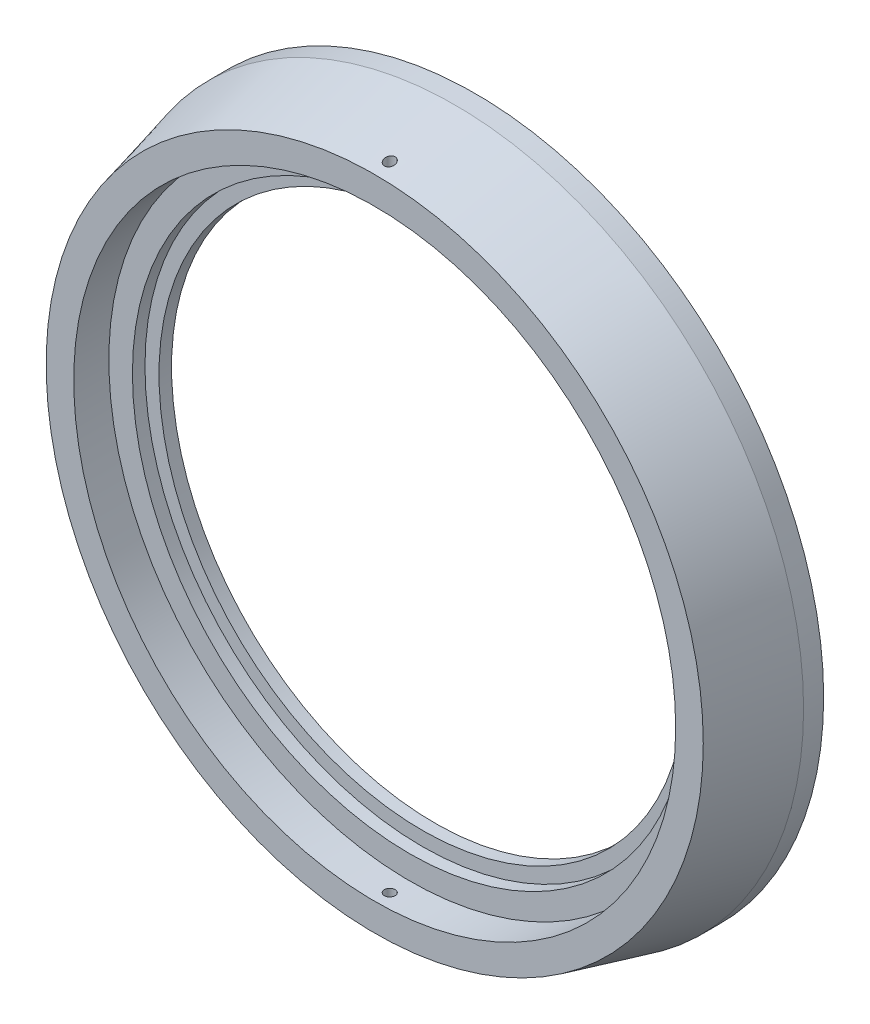
ISO-10303-21;
HEADER;
FILE_DESCRIPTION(('STEP AP214'),'2;1');
FILE_NAME('part.step','',(''),(''),'','','');
FILE_SCHEMA(('AUTOMOTIVE_DESIGN { 1 0 10303 214 1 1 1 1 }'));
ENDSEC;
DATA;
#1=APPLICATION_CONTEXT('core data for automotive mechanical design processes');
#2=APPLICATION_PROTOCOL_DEFINITION('international standard','automotive_design',2000,#1);
#3=PRODUCT_CONTEXT('',#1,'mechanical');
#4=PRODUCT('Part','Part','',(#3));
#5=PRODUCT_RELATED_PRODUCT_CATEGORY('part','',(#4));
#6=PRODUCT_DEFINITION_FORMATION('','',#4);
#7=PRODUCT_DEFINITION_CONTEXT('part definition',#1,'design');
#8=PRODUCT_DEFINITION('design','',#6,#7);
#9=PRODUCT_DEFINITION_SHAPE('','',#8);
#10=(LENGTH_UNIT() NAMED_UNIT(*) SI_UNIT(.MILLI.,.METRE.));
#11=(NAMED_UNIT(*) PLANE_ANGLE_UNIT() SI_UNIT($,.RADIAN.));
#12=(NAMED_UNIT(*) SI_UNIT($,.STERADIAN.) SOLID_ANGLE_UNIT());
#13=UNCERTAINTY_MEASURE_WITH_UNIT(LENGTH_MEASURE(1.E-05),#10,'distance_accuracy_value','');
#14=(GEOMETRIC_REPRESENTATION_CONTEXT(3) GLOBAL_UNCERTAINTY_ASSIGNED_CONTEXT((#13)) GLOBAL_UNIT_ASSIGNED_CONTEXT((#10,
#11,#12)) REPRESENTATION_CONTEXT('',''));
#15=CARTESIAN_POINT('',(0.,0.,0.));
#16=DIRECTION('',(0.,0.,1.));
#17=DIRECTION('',(1.,0.,0.));
#18=AXIS2_PLACEMENT_3D('',#15,#16,#17);
#19=CARTESIAN_POINT('',(0.,0.,25.4));
#20=DIRECTION('',(0.,0.,-1.));
#21=DIRECTION('',(-1.,0.,0.));
#22=AXIS2_PLACEMENT_3D('',#19,#20,#21);
#23=CYLINDRICAL_SURFACE('',#22,88.265);
#24=CARTESIAN_POINT('',(0.,0.,5.07999999999994));
#25=DIRECTION('',(0.,0.,1.));
#26=DIRECTION('',(1.,0.,0.));
#27=AXIS2_PLACEMENT_3D('',#24,#25,#26);
#28=CIRCLE('',#27,88.265);
#29=CARTESIAN_POINT('',(88.265,0.,5.07999999999994));
#30=VERTEX_POINT('',#29);
#31=EDGE_CURVE('E10',#30,#30,#28,.F.);
#32=ORIENTED_EDGE('',*,*,#31,.T.);
#33=EDGE_LOOP('',(#32));
#34=FACE_BOUND('',#33,.T.);
#35=CARTESIAN_POINT('',(0.,0.,0.));
#36=DIRECTION('',(0.,0.,1.));
#37=DIRECTION('',(1.,0.,0.));
#38=AXIS2_PLACEMENT_3D('',#35,#36,#37);
#39=CIRCLE('',#38,88.265);
#40=CARTESIAN_POINT('',(88.265,0.,0.));
#41=VERTEX_POINT('',#40);
#42=EDGE_CURVE('E121',#41,#41,#39,.T.);
#43=ORIENTED_EDGE('',*,*,#42,.T.);
#44=EDGE_LOOP('',(#43));
#45=FACE_BOUND('',#44,.T.);
#46=ADVANCED_FACE('F33',(#34,#45),#23,.T.);
#47=CARTESIAN_POINT('',(0.,0.,25.4));
#48=DIRECTION('',(0.,0.,1.));
#49=DIRECTION('',(1.,0.,0.));
#50=AXIS2_PLACEMENT_3D('',#47,#48,#49);
#51=PLANE('',#50);
#52=CARTESIAN_POINT('',(0.,0.,25.4));
#53=DIRECTION('',(0.,0.,1.));
#54=DIRECTION('',(1.,0.,0.));
#55=AXIS2_PLACEMENT_3D('',#52,#53,#54);
#56=CIRCLE('',#55,83.1850000000001);
#57=CARTESIAN_POINT('',(83.1850000000001,0.,25.4));
#58=VERTEX_POINT('',#57);
#59=EDGE_CURVE('E47',#58,#58,#56,.T.);
#60=ORIENTED_EDGE('',*,*,#59,.T.);
#61=EDGE_LOOP('',(#60));
#62=FACE_BOUND('',#61,.T.);
#63=CARTESIAN_POINT('',(0.,0.,25.4));
#64=DIRECTION('',(0.,0.,1.));
#65=DIRECTION('',(1.,0.,0.));
#66=AXIS2_PLACEMENT_3D('',#63,#64,#65);
#67=CIRCLE('',#66,76.2);
#68=CARTESIAN_POINT('',(76.2,0.,25.4));
#69=VERTEX_POINT('',#68);
#70=EDGE_CURVE('E127',#69,#69,#67,.T.);
#71=ORIENTED_EDGE('',*,*,#70,.F.);
#72=EDGE_LOOP('',(#71));
#73=FACE_BOUND('',#72,.T.);
#74=ADVANCED_FACE('F93',(#62,#73),#51,.T.);
#75=CARTESIAN_POINT('',(0.,0.,0.));
#76=DIRECTION('',(0.,0.,1.));
#77=DIRECTION('',(1.,0.,0.));
#78=AXIS2_PLACEMENT_3D('',#75,#76,#77);
#79=PLANE('',#78);
#80=CARTESIAN_POINT('',(0.,0.,0.));
#81=DIRECTION('',(0.,0.,1.));
#82=DIRECTION('',(1.,0.,0.));
#83=AXIS2_PLACEMENT_3D('',#80,#81,#82);
#84=CIRCLE('',#83,85.0900000000001);
#85=CARTESIAN_POINT('',(85.0900000000001,0.,0.));
#86=VERTEX_POINT('',#85);
#87=EDGE_CURVE('E120',#86,#86,#84,.T.);
#88=ORIENTED_EDGE('',*,*,#87,.T.);
#89=EDGE_LOOP('',(#88));
#90=FACE_BOUND('',#89,.T.);
#91=ORIENTED_EDGE('',*,*,#42,.F.);
#92=EDGE_LOOP('',(#91));
#93=FACE_BOUND('',#92,.T.);
#94=ADVANCED_FACE('F90',(#90,#93),#79,.F.);
#95=CARTESIAN_POINT('',(0.,0.,16.51));
#96=DIRECTION('',(0.,0.,1.));
#97=DIRECTION('',(1.,0.,0.));
#98=AXIS2_PLACEMENT_3D('',#95,#96,#97);
#99=CYLINDRICAL_SURFACE('',#98,76.2);
#100=CARTESIAN_POINT('',(0.,-76.2,22.94255));
#101=CARTESIAN_POINT('',(-0.0759669074774069,-76.1999998378742,22.9425466331847));
#102=CARTESIAN_POINT('',(-0.151988745815618,-76.1998851787984,22.936128421243));
#103=CARTESIAN_POINT('',(-0.301938301095269,-76.1994388035482,22.910614211512));
#104=CARTESIAN_POINT('',(-0.375863392927439,-76.1991068268139,22.8915029946487));
#105=CARTESIAN_POINT('',(-0.519425391470339,-76.1982634195032,22.8411473939451));
#106=CARTESIAN_POINT('',(-0.589064345061549,-76.1977520753791,22.8099088545182));
#107=CARTESIAN_POINT('',(-0.722089961107198,-76.1966076443374,22.7361935091371));
#108=CARTESIAN_POINT('',(-0.785478162989313,-76.195974587509,22.6937194797829));
#109=CARTESIAN_POINT('',(-0.904238684616683,-76.1946578574602,22.5987253088508));
#110=CARTESIAN_POINT('',(-0.95960937432539,-76.1939741739895,22.5462031294127));
#111=CARTESIAN_POINT('',(-1.06074967207332,-76.1926333390444,22.4326062917467));
#112=CARTESIAN_POINT('',(-1.10651890121301,-76.1919761886178,22.3715312961602));
#113=CARTESIAN_POINT('',(-1.1871565399293,-76.1907625089503,22.2425603957166));
#114=CARTESIAN_POINT('',(-1.22202443302614,-76.1902059844773,22.1746641678868));
#115=CARTESIAN_POINT('',(-1.27986607308,-76.1892563583924,22.0339805256085));
#116=CARTESIAN_POINT('',(-1.30283985227314,-76.1888632563375,21.9611931244169));
#117=CARTESIAN_POINT('',(-1.33623888601138,-76.1882848447229,21.8128013395294));
#118=CARTESIAN_POINT('',(-1.34666545686165,-76.1880995133665,21.7371972521851));
#119=CARTESIAN_POINT('',(-1.35467813973471,-76.1879574732292,21.5853116357057));
#120=CARTESIAN_POINT('',(-1.3522642847361,-76.1880007638611,21.509030108311));
#121=CARTESIAN_POINT('',(-1.33466579816262,-76.1883110655371,21.3579639178083));
#122=CARTESIAN_POINT('',(-1.3194826023224,-76.1885780514298,21.2831790873852));
#123=CARTESIAN_POINT('',(-1.27677864194829,-76.1893056048265,21.1372199900916));
#124=CARTESIAN_POINT('',(-1.24925785943487,-76.1897661726127,21.0660457284829));
#125=CARTESIAN_POINT('',(-1.18265830329285,-76.1908289954626,20.9293236170586));
#126=CARTESIAN_POINT('',(-1.14357887125426,-76.1914312585972,20.8637760880304));
#127=CARTESIAN_POINT('',(-1.05497185868232,-76.1927095654849,20.7401716609654));
#128=CARTESIAN_POINT('',(-1.00544427253683,-76.1933856092777,20.6821147669521));
#129=CARTESIAN_POINT('',(-0.897338724758428,-76.1947353741616,20.5751312510439));
#130=CARTESIAN_POINT('',(-0.838759514338877,-76.1954090949192,20.5262058910197));
#131=CARTESIAN_POINT('',(-0.714218000790629,-76.1966781696117,20.4388839872142));
#132=CARTESIAN_POINT('',(-0.648255696625329,-76.1972735235357,20.4004874449112));
#133=CARTESIAN_POINT('',(-0.510819774243615,-76.1983187488552,20.335313286856));
#134=CARTESIAN_POINT('',(-0.439346138116478,-76.1987686197779,20.3085357088649));
#135=CARTESIAN_POINT('',(-0.292916773538377,-76.1994721542837,20.2673604072213));
#136=CARTESIAN_POINT('',(-0.217961048506837,-76.1997258180595,20.2529626714121));
#137=CARTESIAN_POINT('',(-0.0667062213955087,-76.200008317358,20.2369573008651));
#138=CARTESIAN_POINT('',(0.00959269596030566,-76.200037183558,20.2353479209555));
#139=CARTESIAN_POINT('',(0.161377649239881,-76.1998669146438,20.2449604020077));
#140=CARTESIAN_POINT('',(0.236863685469302,-76.1996677796155,20.2561822581445));
#141=CARTESIAN_POINT('',(0.384875210611773,-76.199063976081,20.2911372152587));
#142=CARTESIAN_POINT('',(0.457400886251323,-76.1986593205598,20.3148695258137));
#143=CARTESIAN_POINT('',(0.597438637185702,-76.1976900897235,20.3741709020947));
#144=CARTESIAN_POINT('',(0.664950709369711,-76.1971255143091,20.409739975165));
#145=CARTESIAN_POINT('',(0.793052841652805,-76.1959000007932,20.4917096840977));
#146=CARTESIAN_POINT('',(0.853642149599283,-76.1952390522386,20.5381114952644));
#147=CARTESIAN_POINT('',(0.966171281089702,-76.1938953343097,20.6404277663038));
#148=CARTESIAN_POINT('',(1.01811109463508,-76.1932125649103,20.6963422371728));
#149=CARTESIAN_POINT('',(1.11187263263853,-76.1919020930612,20.8161040660548));
#150=CARTESIAN_POINT('',(1.15369323013789,-76.1912743967499,20.8799523064401));
#151=CARTESIAN_POINT('',(1.22602145423821,-76.1901449365393,21.0137646644544));
#152=CARTESIAN_POINT('',(1.25652909753619,-76.189643172454,21.0837287730567));
#153=CARTESIAN_POINT('',(1.30536345792658,-76.1888221910407,21.2277825717002));
#154=CARTESIAN_POINT('',(1.32369090964356,-76.1885029627034,21.301872012638));
#155=CARTESIAN_POINT('',(1.34764705469373,-76.1880830126007,21.4520769454782));
#156=CARTESIAN_POINT('',(1.35327573705041,-76.1879822910241,21.5281924391318));
#157=CARTESIAN_POINT('',(1.35167444377856,-76.1880107148274,21.680277357896));
#158=CARTESIAN_POINT('',(1.34444625847786,-76.1881398282026,21.7562468018694));
#159=CARTESIAN_POINT('',(1.31734006453382,-76.1886132989662,21.9058938214221));
#160=CARTESIAN_POINT('',(1.29746203056458,-76.1889576567854,21.9795713924125));
#161=CARTESIAN_POINT('',(1.24562035132228,-76.1898227950832,22.1225446571929));
#162=CARTESIAN_POINT('',(1.21365648578813,-76.1903435787769,22.1918402710959));
#163=CARTESIAN_POINT('',(1.13855198849061,-76.1915028311673,22.3240793760186));
#164=CARTESIAN_POINT('',(1.09541178343179,-76.1921412953707,22.387023109421));
#165=CARTESIAN_POINT('',(0.999177330169194,-76.1934639842775,22.5047778297104));
#166=CARTESIAN_POINT('',(0.946082755101834,-76.194148210483,22.5595885494342));
#167=CARTESIAN_POINT('',(0.83142986774511,-76.1954854555648,22.6595325567061));
#168=CARTESIAN_POINT('',(0.769869457865953,-76.1961384666527,22.7046634387537));
#169=CARTESIAN_POINT('',(0.64001700804528,-76.1973398063743,22.7839695263822));
#170=CARTESIAN_POINT('',(0.571721371015463,-76.197888078606,22.8181388358245));
#171=CARTESIAN_POINT('',(0.430415153129954,-76.1988170118837,22.8744869660583));
#172=CARTESIAN_POINT('',(0.357410332000133,-76.1991978733911,22.8966801346471));
#173=CARTESIAN_POINT('',(0.236618061433265,-76.1996468964467,22.9225427725886));
#174=CARTESIAN_POINT('',(0.189615204522879,-76.1997787384244,22.9300360924694));
#175=CARTESIAN_POINT('',(0.0950820726826146,-76.1999553409383,22.9400407596581));
#176=CARTESIAN_POINT('',(0.0475517978062935,-76.2000001014833,22.9425521074719));
#177=CARTESIAN_POINT('',(0.,-76.2,22.94255));
#178=B_SPLINE_CURVE_WITH_KNOTS('',3,(#100,#101,#102,#103,#104,#105,#106,#107,#108,#109,#110,
#111,#112,#113,#114,#115,#116,#117,#118,#119,#120,#121,#122,#123,#124,#125,#126,#127,#128,#129,
#130,#131,#132,#133,#134,#135,#136,#137,#138,#139,#140,#141,#142,#143,#144,#145,#146,#147,#148,
#149,#150,#151,#152,#153,#154,#155,#156,#157,#158,#159,#160,#161,#162,#163,#164,#165,#166,#167,
#168,#169,#170,#171,#172,#173,#174,#175,#176,#177),.UNSPECIFIED.,.T.,.F.,(4,2,2,2,2,2,2,2,2,2,2,
2,2,2,2,2,2,2,2,2,2,2,2,2,2,2,2,2,2,2,2,2,2,2,2,2,2,2,4),(0.,0.227727156300745,
0.455727854475548,0.683618810415413,0.911453500732213,1.13933444716636,1.36722438470652,
1.5951251175023,1.82302523262501,2.05090143706986,2.27877705625118,2.5066270574158,
2.73447739062671,2.96234070527086,3.19020414231008,3.41809904412168,3.64599397793029,
3.87388965238295,4.10178510304599,4.32964945326332,4.55751371779616,4.78536358737521,
5.01321359832837,5.24108834150329,5.46896334809294,5.69686372103955,5.92476375762211,
6.1526500476094,6.38053653457581,6.60839129067333,6.83624650295367,7.06410586803551,
7.29195653489346,7.51981468481001,7.74772939346766,7.97576649078758,8.20352978245351,
8.3460765459146,8.48862329490048),.UNSPECIFIED.);
#179=CARTESIAN_POINT('',(0.,-76.2,22.94255));
#180=VERTEX_POINT('',#179);
#181=EDGE_CURVE('E79',#180,#180,#178,.T.);
#182=ORIENTED_EDGE('',*,*,#181,.T.);
#183=EDGE_LOOP('',(#182));
#184=FACE_BOUND('',#183,.T.);
#185=CARTESIAN_POINT('',(0.,76.2,22.94255));
#186=CARTESIAN_POINT('',(0.0759669074774069,76.1999998378742,22.9425466331847));
#187=CARTESIAN_POINT('',(0.151988745815618,76.1998851787984,22.936128421243));
#188=CARTESIAN_POINT('',(0.301938301095269,76.1994388035482,22.910614211512));
#189=CARTESIAN_POINT('',(0.375863392927439,76.1991068268139,22.8915029946487));
#190=CARTESIAN_POINT('',(0.519425391470339,76.1982634195032,22.8411473939451));
#191=CARTESIAN_POINT('',(0.589064345061549,76.1977520753791,22.8099088545182));
#192=CARTESIAN_POINT('',(0.722089961107198,76.1966076443374,22.7361935091371));
#193=CARTESIAN_POINT('',(0.785478162989313,76.195974587509,22.6937194797829));
#194=CARTESIAN_POINT('',(0.904238684616683,76.1946578574602,22.5987253088508));
#195=CARTESIAN_POINT('',(0.95960937432539,76.1939741739895,22.5462031294127));
#196=CARTESIAN_POINT('',(1.06074967207332,76.1926333390444,22.4326062917467));
#197=CARTESIAN_POINT('',(1.10651890121301,76.1919761886178,22.3715312961602));
#198=CARTESIAN_POINT('',(1.1871565399293,76.1907625089503,22.2425603957166));
#199=CARTESIAN_POINT('',(1.22202443302614,76.1902059844773,22.1746641678868));
#200=CARTESIAN_POINT('',(1.27986607308,76.1892563583924,22.0339805256085));
#201=CARTESIAN_POINT('',(1.30283985227314,76.1888632563375,21.9611931244169));
#202=CARTESIAN_POINT('',(1.33623888601138,76.1882848447229,21.8128013395294));
#203=CARTESIAN_POINT('',(1.34666545686165,76.1880995133665,21.7371972521851));
#204=CARTESIAN_POINT('',(1.35467813973471,76.1879574732292,21.5853116357057));
#205=CARTESIAN_POINT('',(1.3522642847361,76.1880007638611,21.509030108311));
#206=CARTESIAN_POINT('',(1.33466579816262,76.1883110655371,21.3579639178083));
#207=CARTESIAN_POINT('',(1.3194826023224,76.1885780514298,21.2831790873852));
#208=CARTESIAN_POINT('',(1.27677864194829,76.1893056048265,21.1372199900916));
#209=CARTESIAN_POINT('',(1.24925785943487,76.1897661726127,21.0660457284829));
#210=CARTESIAN_POINT('',(1.18265830329285,76.1908289954626,20.9293236170586));
#211=CARTESIAN_POINT('',(1.14357887125426,76.1914312585972,20.8637760880304));
#212=CARTESIAN_POINT('',(1.05497185868232,76.1927095654849,20.7401716609654));
#213=CARTESIAN_POINT('',(1.00544427253683,76.1933856092777,20.6821147669521));
#214=CARTESIAN_POINT('',(0.897338724758428,76.1947353741616,20.5751312510439));
#215=CARTESIAN_POINT('',(0.838759514338877,76.1954090949192,20.5262058910197));
#216=CARTESIAN_POINT('',(0.714218000790629,76.1966781696117,20.4388839872142));
#217=CARTESIAN_POINT('',(0.648255696625329,76.1972735235357,20.4004874449112));
#218=CARTESIAN_POINT('',(0.510819774243615,76.1983187488552,20.335313286856));
#219=CARTESIAN_POINT('',(0.439346138116478,76.1987686197779,20.3085357088649));
#220=CARTESIAN_POINT('',(0.292916773538377,76.1994721542837,20.2673604072213));
#221=CARTESIAN_POINT('',(0.217961048506837,76.1997258180595,20.2529626714121));
#222=CARTESIAN_POINT('',(0.0667062213955087,76.200008317358,20.2369573008651));
#223=CARTESIAN_POINT('',(-0.00959269596030566,76.200037183558,20.2353479209555));
#224=CARTESIAN_POINT('',(-0.161377649239881,76.1998669146438,20.2449604020077));
#225=CARTESIAN_POINT('',(-0.236863685469302,76.1996677796155,20.2561822581445));
#226=CARTESIAN_POINT('',(-0.384875210611773,76.199063976081,20.2911372152587));
#227=CARTESIAN_POINT('',(-0.457400886251323,76.1986593205598,20.3148695258137));
#228=CARTESIAN_POINT('',(-0.597438637185702,76.1976900897235,20.3741709020947));
#229=CARTESIAN_POINT('',(-0.664950709369711,76.1971255143091,20.409739975165));
#230=CARTESIAN_POINT('',(-0.793052841652805,76.1959000007932,20.4917096840977));
#231=CARTESIAN_POINT('',(-0.853642149599283,76.1952390522386,20.5381114952644));
#232=CARTESIAN_POINT('',(-0.966171281089702,76.1938953343097,20.6404277663038));
#233=CARTESIAN_POINT('',(-1.01811109463508,76.1932125649103,20.6963422371728));
#234=CARTESIAN_POINT('',(-1.11187263263853,76.1919020930612,20.8161040660548));
#235=CARTESIAN_POINT('',(-1.15369323013789,76.1912743967499,20.8799523064401));
#236=CARTESIAN_POINT('',(-1.22602145423821,76.1901449365393,21.0137646644544));
#237=CARTESIAN_POINT('',(-1.25652909753619,76.189643172454,21.0837287730567));
#238=CARTESIAN_POINT('',(-1.30536345792658,76.1888221910407,21.2277825717002));
#239=CARTESIAN_POINT('',(-1.32369090964356,76.1885029627034,21.301872012638));
#240=CARTESIAN_POINT('',(-1.34764705469373,76.1880830126007,21.4520769454782));
#241=CARTESIAN_POINT('',(-1.35327573705041,76.1879822910241,21.5281924391318));
#242=CARTESIAN_POINT('',(-1.35167444377856,76.1880107148274,21.680277357896));
#243=CARTESIAN_POINT('',(-1.34444625847786,76.1881398282026,21.7562468018694));
#244=CARTESIAN_POINT('',(-1.31734006453382,76.1886132989662,21.9058938214221));
#245=CARTESIAN_POINT('',(-1.29746203056458,76.1889576567854,21.9795713924125));
#246=CARTESIAN_POINT('',(-1.24562035132228,76.1898227950832,22.1225446571929));
#247=CARTESIAN_POINT('',(-1.21365648578813,76.1903435787769,22.1918402710959));
#248=CARTESIAN_POINT('',(-1.13855198849061,76.1915028311673,22.3240793760186));
#249=CARTESIAN_POINT('',(-1.09541178343179,76.1921412953707,22.387023109421));
#250=CARTESIAN_POINT('',(-0.999177330169194,76.1934639842775,22.5047778297104));
#251=CARTESIAN_POINT('',(-0.946082755101834,76.194148210483,22.5595885494342));
#252=CARTESIAN_POINT('',(-0.83142986774511,76.1954854555648,22.6595325567061));
#253=CARTESIAN_POINT('',(-0.769869457865953,76.1961384666527,22.7046634387537));
#254=CARTESIAN_POINT('',(-0.64001700804528,76.1973398063743,22.7839695263822));
#255=CARTESIAN_POINT('',(-0.571721371015463,76.197888078606,22.8181388358245));
#256=CARTESIAN_POINT('',(-0.430415153129954,76.1988170118837,22.8744869660583));
#257=CARTESIAN_POINT('',(-0.357410332000133,76.1991978733911,22.8966801346471));
#258=CARTESIAN_POINT('',(-0.236618061433265,76.1996468964467,22.9225427725886));
#259=CARTESIAN_POINT('',(-0.189615204522879,76.1997787384244,22.9300360924694));
#260=CARTESIAN_POINT('',(-0.0950820726826146,76.1999553409383,22.9400407596581));
#261=CARTESIAN_POINT('',(-0.0475517978062935,76.2000001014833,22.9425521074719));
#262=CARTESIAN_POINT('',(0.,76.2,22.94255));
#263=B_SPLINE_CURVE_WITH_KNOTS('',3,(#185,#186,#187,#188,#189,#190,#191,#192,#193,#194,#195,
#196,#197,#198,#199,#200,#201,#202,#203,#204,#205,#206,#207,#208,#209,#210,#211,#212,#213,#214,
#215,#216,#217,#218,#219,#220,#221,#222,#223,#224,#225,#226,#227,#228,#229,#230,#231,#232,#233,
#234,#235,#236,#237,#238,#239,#240,#241,#242,#243,#244,#245,#246,#247,#248,#249,#250,#251,#252,
#253,#254,#255,#256,#257,#258,#259,#260,#261,#262),.UNSPECIFIED.,.T.,.F.,(4,2,2,2,2,2,2,2,2,2,2,
2,2,2,2,2,2,2,2,2,2,2,2,2,2,2,2,2,2,2,2,2,2,2,2,2,2,2,4),(0.,0.227727156300745,
0.455727854475548,0.683618810415413,0.911453500732213,1.13933444716636,1.36722438470652,
1.5951251175023,1.82302523262501,2.05090143706986,2.27877705625118,2.5066270574158,
2.73447739062671,2.96234070527086,3.19020414231008,3.41809904412168,3.64599397793029,
3.87388965238295,4.10178510304599,4.32964945326332,4.55751371779616,4.78536358737521,
5.01321359832837,5.24108834150329,5.46896334809294,5.69686372103955,5.92476375762211,
6.1526500476094,6.38053653457581,6.60839129067333,6.83624650295367,7.06410586803551,
7.29195653489346,7.51981468481001,7.74772939346766,7.97576649078758,8.20352978245351,
8.3460765459146,8.48862329490048),.UNSPECIFIED.);
#264=CARTESIAN_POINT('',(0.,76.2,22.94255));
#265=VERTEX_POINT('',#264);
#266=EDGE_CURVE('E73',#265,#265,#263,.T.);
#267=ORIENTED_EDGE('',*,*,#266,.T.);
#268=EDGE_LOOP('',(#267));
#269=FACE_BOUND('',#268,.T.);
#270=CARTESIAN_POINT('',(0.,0.,16.51));
#271=DIRECTION('',(0.,0.,1.));
#272=DIRECTION('',(1.,0.,0.));
#273=AXIS2_PLACEMENT_3D('',#270,#271,#272);
#274=CIRCLE('',#273,76.2);
#275=CARTESIAN_POINT('',(76.2,0.,16.51));
#276=VERTEX_POINT('',#275);
#277=EDGE_CURVE('E124',#276,#276,#274,.T.);
#278=ORIENTED_EDGE('',*,*,#277,.F.);
#279=EDGE_LOOP('',(#278));
#280=FACE_BOUND('',#279,.T.);
#281=ORIENTED_EDGE('',*,*,#70,.T.);
#282=EDGE_LOOP('',(#281));
#283=FACE_BOUND('',#282,.T.);
#284=ADVANCED_FACE('F84',(#184,#269,#280,#283),#99,.F.);
#285=CARTESIAN_POINT('',(0.,0.,16.51));
#286=DIRECTION('',(0.,0.,1.));
#287=DIRECTION('',(1.,0.,0.));
#288=AXIS2_PLACEMENT_3D('',#285,#286,#287);
#289=PLANE('',#288);
#290=CARTESIAN_POINT('',(0.,0.,16.51));
#291=DIRECTION('',(0.,0.,1.));
#292=DIRECTION('',(1.,0.,0.));
#293=AXIS2_PLACEMENT_3D('',#290,#291,#292);
#294=CIRCLE('',#293,70.231);
#295=CARTESIAN_POINT('',(70.231,0.,16.51));
#296=VERTEX_POINT('',#295);
#297=EDGE_CURVE('E133',#296,#296,#294,.T.);
#298=ORIENTED_EDGE('',*,*,#297,.F.);
#299=EDGE_LOOP('',(#298));
#300=FACE_BOUND('',#299,.T.);
#301=ORIENTED_EDGE('',*,*,#277,.T.);
#302=EDGE_LOOP('',(#301));
#303=FACE_BOUND('',#302,.T.);
#304=ADVANCED_FACE('F89',(#300,#303),#289,.T.);
#305=CARTESIAN_POINT('',(0.,0.,13.335));
#306=DIRECTION('',(0.,0.,1.));
#307=DIRECTION('',(1.,0.,0.));
#308=AXIS2_PLACEMENT_3D('',#305,#306,#307);
#309=CYLINDRICAL_SURFACE('',#308,70.231);
#310=CARTESIAN_POINT('',(0.,0.,13.335));
#311=DIRECTION('',(0.,0.,1.));
#312=DIRECTION('',(1.,0.,0.));
#313=AXIS2_PLACEMENT_3D('',#310,#311,#312);
#314=CIRCLE('',#313,70.231);
#315=CARTESIAN_POINT('',(70.231,0.,13.335));
#316=VERTEX_POINT('',#315);
#317=EDGE_CURVE('E130',#316,#316,#314,.T.);
#318=ORIENTED_EDGE('',*,*,#317,.F.);
#319=EDGE_LOOP('',(#318));
#320=FACE_BOUND('',#319,.T.);
#321=ORIENTED_EDGE('',*,*,#297,.T.);
#322=EDGE_LOOP('',(#321));
#323=FACE_BOUND('',#322,.T.);
#324=ADVANCED_FACE('F153',(#320,#323),#309,.F.);
#325=CARTESIAN_POINT('',(0.,0.,13.335));
#326=DIRECTION('',(0.,0.,1.));
#327=DIRECTION('',(1.,0.,0.));
#328=AXIS2_PLACEMENT_3D('',#325,#326,#327);
#329=PLANE('',#328);
#330=CARTESIAN_POINT('',(0.,0.,13.335));
#331=DIRECTION('',(0.,0.,1.));
#332=DIRECTION('',(1.,0.,0.));
#333=AXIS2_PLACEMENT_3D('',#330,#331,#332);
#334=CIRCLE('',#333,66.675);
#335=CARTESIAN_POINT('',(66.675,0.,13.335));
#336=VERTEX_POINT('',#335);
#337=EDGE_CURVE('E136',#336,#336,#334,.T.);
#338=ORIENTED_EDGE('',*,*,#337,.F.);
#339=EDGE_LOOP('',(#338));
#340=FACE_BOUND('',#339,.T.);
#341=ORIENTED_EDGE('',*,*,#317,.T.);
#342=EDGE_LOOP('',(#341));
#343=FACE_BOUND('',#342,.T.);
#344=ADVANCED_FACE('F113',(#340,#343),#329,.T.);
#345=CARTESIAN_POINT('',(0.,0.,0.));
#346=DIRECTION('',(0.,0.,1.));
#347=DIRECTION('',(1.,0.,0.));
#348=AXIS2_PLACEMENT_3D('',#345,#346,#347);
#349=CYLINDRICAL_SURFACE('',#348,66.675);
#350=CARTESIAN_POINT('',(0.,0.,10.16));
#351=DIRECTION('',(0.,0.,1.));
#352=DIRECTION('',(1.,0.,0.));
#353=AXIS2_PLACEMENT_3D('',#350,#351,#352);
#354=CIRCLE('',#353,66.675);
#355=CARTESIAN_POINT('',(66.675,0.,10.16));
#356=VERTEX_POINT('',#355);
#357=EDGE_CURVE('E52',#356,#356,#354,.F.);
#358=ORIENTED_EDGE('',*,*,#357,.T.);
#359=EDGE_LOOP('',(#358));
#360=FACE_BOUND('',#359,.T.);
#361=ORIENTED_EDGE('',*,*,#337,.T.);
#362=EDGE_LOOP('',(#361));
#363=FACE_BOUND('',#362,.T.);
#364=ADVANCED_FACE('F66',(#360,#363),#349,.F.);
#365=CARTESIAN_POINT('',(0.,0.,0.));
#366=DIRECTION('',(0.,0.,-1.));
#367=DIRECTION('',(-1.,0.,0.));
#368=AXIS2_PLACEMENT_3D('',#365,#366,#367);
#369=CONICAL_SURFACE('',#368,85.0900000000001,1.06663036531574);
#370=ORIENTED_EDGE('',*,*,#357,.F.);
#371=EDGE_LOOP('',(#370));
#372=FACE_BOUND('',#371,.T.);
#373=ORIENTED_EDGE('',*,*,#87,.F.);
#374=EDGE_LOOP('',(#373));
#375=FACE_BOUND('',#374,.T.);
#376=ADVANCED_FACE('F103',(#372,#375),#369,.F.);
#377=CARTESIAN_POINT('',(0.,0.,25.4));
#378=DIRECTION('',(0.,0.,-1.));
#379=DIRECTION('',(-1.,0.,0.));
#380=AXIS2_PLACEMENT_3D('',#377,#378,#379);
#381=CONICAL_SURFACE('',#380,83.1850000000001,0.24497866312686);
#382=CARTESIAN_POINT('',(-0.743547285817706,-84.4166844087982,20.4601641994001));
#383=CARTESIAN_POINT('',(-0.682041553541964,-84.4273448907409,20.4196905044803));
#384=CARTESIAN_POINT('',(-0.617033394790605,-84.4367412992307,20.384125323894));
#385=CARTESIAN_POINT('',(-0.48173859631147,-84.4526583190494,20.323979425223));
#386=CARTESIAN_POINT('',(-0.41144758478038,-84.4591765171684,20.2994079244628));
#387=CARTESIAN_POINT('',(-0.267539166721088,-84.4690839715068,20.2620919322633));
#388=CARTESIAN_POINT('',(-0.193920378946913,-84.4724719157212,20.2493524000268));
#389=CARTESIAN_POINT('',(-0.0455274544807273,-84.4759787855276,20.2361660644556));
#390=CARTESIAN_POINT('',(0.0292464278698867,-84.4760984207887,20.2357165925009));
#391=CARTESIAN_POINT('',(0.17690753627746,-84.4730841225392,20.2470501392199));
#392=CARTESIAN_POINT('',(0.249806603341921,-84.4699883096824,20.2586898350636));
#393=CARTESIAN_POINT('',(0.392561357537923,-84.46072118503,20.2935869274424));
#394=CARTESIAN_POINT('',(0.462416968108329,-84.4545497959139,20.3168446160561));
#395=CARTESIAN_POINT('',(0.597478124389547,-84.4393277143234,20.3743427126531));
#396=CARTESIAN_POINT('',(0.66266159592761,-84.4302643321929,20.4086315292288));
#397=CARTESIAN_POINT('',(0.786335323766511,-84.409590203723,20.4870799738712));
#398=CARTESIAN_POINT('',(0.844824905581787,-84.3979792010251,20.5312405953129));
#399=CARTESIAN_POINT('',(0.954987834302524,-84.372290743793,20.6292933409985));
#400=CARTESIAN_POINT('',(1.00646262459369,-84.358160529438,20.6833945932143));
#401=CARTESIAN_POINT('',(1.09964515871737,-84.3280944590419,20.7989964954559));
#402=CARTESIAN_POINT('',(1.14135137740102,-84.312158321621,20.8604982986501));
#403=CARTESIAN_POINT('',(1.21520747297268,-84.2784306560932,20.9912690807092));
#404=CARTESIAN_POINT('',(1.24700974753727,-84.2605961362294,21.0607233464705));
#405=CARTESIAN_POINT('',(1.29846285563551,-84.2240507268694,21.2037793913183));
#406=CARTESIAN_POINT('',(1.31811190024361,-84.2053397087905,21.2773817792592));
#407=CARTESIAN_POINT('',(1.34513933783405,-84.1670948794911,21.4286325469216));
#408=CARTESIAN_POINT('',(1.35219723366085,-84.1475522053887,21.506336114093));
#409=CARTESIAN_POINT('',(1.35287698626857,-84.1086567927326,21.6618539410862));
#410=CARTESIAN_POINT('',(1.34649788102117,-84.0893040678781,21.7396682084349));
#411=CARTESIAN_POINT('',(1.32032250753066,-84.0511808984592,21.8938021407227));
#412=CARTESIAN_POINT('',(1.3004253418633,-84.0324159507354,21.9701060935272));
#413=CARTESIAN_POINT('',(1.24756185356459,-83.9961474951633,22.118369146654));
#414=CARTESIAN_POINT('',(1.21459606139512,-83.9786439361486,22.1903284231922));
#415=CARTESIAN_POINT('',(1.1368891119592,-83.9455944690152,22.326864317141));
#416=CARTESIAN_POINT('',(1.09229699528194,-83.9300272250831,22.3915205046954));
#417=CARTESIAN_POINT('',(0.992311230009246,-83.9010415542389,22.5124210713763));
#418=CARTESIAN_POINT('',(0.936919041540139,-83.8876228373008,22.5686665857778));
#419=CARTESIAN_POINT('',(0.818393022827501,-83.863627895914,22.6695971226128));
#420=CARTESIAN_POINT('',(0.755490343643131,-83.8529883801635,22.7145384840494));
#421=CARTESIAN_POINT('',(0.622651526979279,-83.8344180049359,22.7931837921908));
#422=CARTESIAN_POINT('',(0.552716525611476,-83.8264867088378,22.8268895502867));
#423=CARTESIAN_POINT('',(0.409815349068226,-83.8137343098608,22.8811734658045));
#424=CARTESIAN_POINT('',(0.336980111975049,-83.8088357595051,22.9020783523646));
#425=CARTESIAN_POINT('',(0.188711720841459,-83.8019577031717,22.9314502620156));
#426=CARTESIAN_POINT('',(0.113278872540181,-83.799977854856,22.9399187437867));
#427=CARTESIAN_POINT('',(-0.0366389312943425,-83.7990010202694,22.944095683496));
#428=CARTESIAN_POINT('',(-0.111117534841726,-83.7999527189878,22.9400236559605));
#429=CARTESIAN_POINT('',(-0.258304842012806,-83.8047011122244,22.9197325115871));
#430=CARTESIAN_POINT('',(-0.33101360821341,-83.8084977060031,22.90351382487));
#431=CARTESIAN_POINT('',(-0.472464957484916,-83.8188218690026,22.8595053824765));
#432=CARTESIAN_POINT('',(-0.541215399769004,-83.8253437982332,22.8317395238481));
#433=CARTESIAN_POINT('',(-0.673040452439156,-83.8409442326623,22.7655210610841));
#434=CARTESIAN_POINT('',(-0.736114796222065,-83.8500228578648,22.7270679553209));
#435=CARTESIAN_POINT('',(-0.855746839521925,-83.8706401804858,22.6400633927235));
#436=CARTESIAN_POINT('',(-0.912204469571492,-83.8822105957008,22.5913819560351));
#437=CARTESIAN_POINT('',(-1.01616374822935,-83.9074353600339,22.4857110904437));
#438=CARTESIAN_POINT('',(-1.06366438605888,-83.9210899440321,22.4287207251799));
#439=CARTESIAN_POINT('',(-1.14961144542434,-83.9504936987654,22.3065860990557));
#440=CARTESIAN_POINT('',(-1.18780841231129,-83.9662858796365,22.2412766940078));
#441=CARTESIAN_POINT('',(-1.2527175858995,-83.9992872392468,22.1055132882406));
#442=CARTESIAN_POINT('',(-1.27942817485723,-84.0164966171778,22.0350585644872));
#443=CARTESIAN_POINT('',(-1.32132968448247,-84.0523665170209,21.8890036033744));
#444=CARTESIAN_POINT('',(-1.33619462093166,-84.0710534900346,21.8133162750395));
#445=CARTESIAN_POINT('',(-1.35288525356502,-84.1089583802662,21.6606487549113));
#446=CARTESIAN_POINT('',(-1.35470986558623,-84.1281763414967,21.5836684561545));
#447=CARTESIAN_POINT('',(-1.34521753487289,-84.1669709113611,21.4291192508668));
#448=CARTESIAN_POINT('',(-1.33366194453548,-84.1865477107229,21.3515649413045));
#449=CARTESIAN_POINT('',(-1.29729803820012,-84.225147808999,21.1994552662531));
#450=CARTESIAN_POINT('',(-1.27248596447102,-84.2441709493578,21.1249007575454));
#451=CARTESIAN_POINT('',(-1.21018144752417,-84.2810957245876,20.9808885816262));
#452=CARTESIAN_POINT('',(-1.17267494899834,-84.2989960901657,20.9114366682144));
#453=CARTESIAN_POINT('',(-1.08594772515889,-84.3330506328456,20.7798761061157));
#454=CARTESIAN_POINT('',(-1.03674192670952,-84.3492069971947,20.717758249994));
#455=CARTESIAN_POINT('',(-0.946715745075795,-84.3740406539644,20.622623146864));
#456=CARTESIAN_POINT('',(-0.908839927599226,-84.3833779630253,20.586949461075));
#457=CARTESIAN_POINT('',(-0.82907971641817,-84.4009171648198,20.5200813348648));
#458=CARTESIAN_POINT('',(-0.787195442370671,-84.4091190914279,20.4888867608064));
#459=CARTESIAN_POINT('',(-0.743547285817706,-84.4166844087982,20.4601641994001));
#460=B_SPLINE_CURVE_WITH_KNOTS('',3,(#382,#383,#384,#385,#386,#387,#388,#389,#390,#391,#392,
#393,#394,#395,#396,#397,#398,#399,#400,#401,#402,#403,#404,#405,#406,#407,#408,#409,#410,#411,
#412,#413,#414,#415,#416,#417,#418,#419,#420,#421,#422,#423,#424,#425,#426,#427,#428,#429,#430,
#431,#432,#433,#434,#435,#436,#437,#438,#439,#440,#441,#442,#443,#444,#445,#446,#447,#448,#449,
#450,#451,#452,#453,#454,#455,#456,#457,#458,#459),.UNSPECIFIED.,.T.,.F.,(4,2,2,2,2,2,2,2,2,2,2,
2,2,2,2,2,2,2,2,2,2,2,2,2,2,2,2,2,2,2,2,2,2,2,2,2,2,2,4),(0.,0.223000777258021,
0.446188174135154,0.66946907470317,0.892701492466015,1.11331726504357,1.33393858422677,
1.55554158744324,1.77716690006141,2.004140604059,2.23114972145127,2.46540627023953,
2.69969729281448,2.9398712239341,3.18006235100199,3.4220662263113,3.66406027957169,
3.90309287828657,4.14209318313436,4.37505059897072,4.6079704394935,4.83466616509672,
5.06133529917737,5.28405940785984,5.50677563011665,5.72903321349281,5.95130123073994,
6.17658606747414,6.40189631195975,6.63270911451875,6.86355441415577,7.10055200136778,
7.33756929215537,7.57887996428426,7.82025907553634,8.06190632157801,8.30324689452164,
8.46150634373635,8.61976107019914),.UNSPECIFIED.);
#461=CARTESIAN_POINT('',(-0.743547285817706,-84.4166844087982,20.4601641994001));
#462=VERTEX_POINT('',#461);
#463=EDGE_CURVE('E39',#462,#462,#460,.T.);
#464=ORIENTED_EDGE('',*,*,#463,.F.);
#465=EDGE_LOOP('',(#464));
#466=FACE_BOUND('',#465,.T.);
#467=CARTESIAN_POINT('',(-1.252704168836,84.255693795631,21.0799766120581));
#468=CARTESIAN_POINT('',(-1.28225091820789,84.2371073380224,21.1525575508231));
#469=CARTESIAN_POINT('',(-1.30545299459889,84.2179711919682,21.227652980989));
#470=CARTESIAN_POINT('',(-1.33855083355261,84.1791915378156,21.3806742094873));
#471=CARTESIAN_POINT('',(-1.34842737946251,84.1595473385446,21.458603929288));
#472=CARTESIAN_POINT('',(-1.35457863659673,84.1203496136393,21.6149794671716));
#473=CARTESIAN_POINT('',(-1.3508617590018,84.1007960394271,21.6934249361361));
#474=CARTESIAN_POINT('',(-1.32990068221098,84.0623257137011,21.8486230495878));
#475=CARTESIAN_POINT('',(-1.31266072267361,84.0434087645355,21.9253762168808));
#476=CARTESIAN_POINT('',(-1.26506671036226,84.0067482013068,22.0749208623116));
#477=CARTESIAN_POINT('',(-1.23472535066101,83.9890034706962,22.1477160983623));
#478=CARTESIAN_POINT('',(-1.161660712782,83.9551629149812,22.287234038109));
#479=CARTESIAN_POINT('',(-1.1189377719635,83.9390670449667,22.3539569071927));
#480=CARTESIAN_POINT('',(-1.02313099220409,83.9092646248352,22.4780447867621));
#481=CARTESIAN_POINT('',(-0.970255975516603,83.8955190030251,22.5355615335795));
#482=CARTESIAN_POINT('',(-0.855079262117143,83.8704447093342,22.640864593558));
#483=CARTESIAN_POINT('',(-0.792779072285774,83.8591156517938,22.6886524592963));
#484=CARTESIAN_POINT('',(-0.662348599188467,83.8394741257628,22.7717365414103));
#485=CARTESIAN_POINT('',(-0.594424145465231,83.8310876864655,22.8073384168595));
#486=CARTESIAN_POINT('',(-0.453289739823901,83.8171472530679,22.8666266240579));
#487=CARTESIAN_POINT('',(-0.38008059460236,83.8115928277063,22.8903147700319));
#488=CARTESIAN_POINT('',(-0.232354204337941,83.8035730511538,22.9245463217778));
#489=CARTESIAN_POINT('',(-0.157910828434439,83.8010365824592,22.9353923187775));
#490=CARTESIAN_POINT('',(-0.00821641898010294,83.79888257696,22.9446017086018));
#491=CARTESIAN_POINT('',(0.0670345448647053,83.7992647902244,22.9429661702391));
#492=CARTESIAN_POINT('',(0.215282640628174,83.8029154836267,22.927361645737));
#493=CARTESIAN_POINT('',(0.288295814596969,83.8061502975353,22.9135365207147));
#494=CARTESIAN_POINT('',(0.430917347662928,83.8153722006479,22.8742016634658));
#495=CARTESIAN_POINT('',(0.500525711466759,83.8213592860473,22.8486919473919));
#496=CARTESIAN_POINT('',(0.634729649659039,83.8359587856663,22.7866616701147));
#497=CARTESIAN_POINT('',(0.699301332316194,83.8445828582433,22.7500922208413));
#498=CARTESIAN_POINT('',(0.821371471782029,83.8642199036203,22.6671203826202));
#499=CARTESIAN_POINT('',(0.878869384831716,83.8752330598891,22.6207172385044));
#500=CARTESIAN_POINT('',(0.986340425670662,83.8995930777043,22.5185071633053));
#501=CARTESIAN_POINT('',(1.03615225968706,83.9129798224158,22.4625402327863));
#502=CARTESIAN_POINT('',(1.12570550755895,83.9415944039807,22.3434785262469));
#503=CARTESIAN_POINT('',(1.16544564036526,83.9568224746742,22.2803828449739));
#504=CARTESIAN_POINT('',(1.23484682308624,83.9891599048419,22.1470809512317));
#505=CARTESIAN_POINT('',(1.26421269849062,84.0063084396539,22.0767305656926));
#506=CARTESIAN_POINT('',(1.31070153414048,84.0416943005306,21.9323548974407));
#507=CARTESIAN_POINT('',(1.32782280564264,84.0599317764033,21.8583291093311));
#508=CARTESIAN_POINT('',(1.34972656146176,84.0974784770499,21.7067667175443));
#509=CARTESIAN_POINT('',(1.35419580880089,84.1168030214966,21.6291885388792));
#510=CARTESIAN_POINT('',(1.349825702649,84.1555671218245,21.4744329571757));
#511=CARTESIAN_POINT('',(1.340985067385,84.1750066886032,21.397255593455));
#512=CARTESIAN_POINT('',(1.31003069636149,84.2136819123474,21.2445230048312));
#513=CARTESIAN_POINT('',(1.28775868809962,84.2329123093141,21.1689984305522));
#514=CARTESIAN_POINT('',(1.23035130489553,84.2703422685197,21.0227262671248));
#515=CARTESIAN_POINT('',(1.19521598058828,84.288541834816,20.9519786591735));
#516=CARTESIAN_POINT('',(1.11327324759317,84.3231864480717,20.8178994080729));
#517=CARTESIAN_POINT('',(1.06655772539009,84.3396439171175,20.7545148937839));
#518=CARTESIAN_POINT('',(0.96252463287197,84.3703954992205,20.6365214972865));
#519=CARTESIAN_POINT('',(0.905208506383206,84.3846899064103,20.5819114218704));
#520=CARTESIAN_POINT('',(0.783167060640895,84.4102457939594,20.4845706190309));
#521=CARTESIAN_POINT('',(0.718673691624958,84.4215765919449,20.4415674532389));
#522=CARTESIAN_POINT('',(0.582936554844213,84.4412485203927,20.3670665316427));
#523=CARTESIAN_POINT('',(0.511694162736043,84.4495902584658,20.3355664374895));
#524=CARTESIAN_POINT('',(0.36698140387126,84.4627288022863,20.2860157761558));
#525=CARTESIAN_POINT('',(0.293659132093489,84.4676321981039,20.2675606470743));
#526=CARTESIAN_POINT('',(0.144825098952841,84.474130091814,20.2431140468199));
#527=CARTESIAN_POINT('',(0.069313668660113,84.4757250874218,20.2371207008975));
#528=CARTESIAN_POINT('',(-0.0799577781872581,84.4755444773599,20.2377997305873));
#529=CARTESIAN_POINT('',(-0.153719333243653,84.4738431753856,20.2441928948274));
#530=CARTESIAN_POINT('',(-0.299072919854904,84.4672839293599,20.2688715630918));
#531=CARTESIAN_POINT('',(-0.370665112475189,84.4624262202617,20.2871561819536));
#532=CARTESIAN_POINT('',(-0.509633026715328,84.4497446045684,20.334985104619));
#533=CARTESIAN_POINT('',(-0.577012015811638,84.4419230306373,20.3645205537267));
#534=CARTESIAN_POINT('',(-0.705844212708305,84.4235951058569,20.4339156936588));
#535=CARTESIAN_POINT('',(-0.767295435435035,84.4130878599069,20.473778826631));
#536=CARTESIAN_POINT('',(-0.883921831955535,84.3895046727203,20.563547611191));
#537=CARTESIAN_POINT('',(-0.938937314836031,84.3763792320926,20.6136473253314));
#538=CARTESIAN_POINT('',(-1.0397651343982,84.3481519295768,20.721819497646));
#539=CARTESIAN_POINT('',(-1.08558692983242,84.3330521256764,20.7798836570884));
#540=CARTESIAN_POINT('',(-1.15134330629269,84.307450599645,20.8787675082194));
#541=CARTESIAN_POINT('',(-1.17445747313325,84.2974130806299,20.9176342329742));
#542=CARTESIAN_POINT('',(-1.21664766615482,84.2768754912196,20.9973826750926));
#543=CARTESIAN_POINT('',(-1.23572367431918,84.266375418761,21.0382644014452));
#544=CARTESIAN_POINT('',(-1.252704168836,84.255693795631,21.0799766120581));
#545=B_SPLINE_CURVE_WITH_KNOTS('',3,(#467,#468,#469,#470,#471,#472,#473,#474,#475,#476,#477,
#478,#479,#480,#481,#482,#483,#484,#485,#486,#487,#488,#489,#490,#491,#492,#493,#494,#495,#496,
#497,#498,#499,#500,#501,#502,#503,#504,#505,#506,#507,#508,#509,#510,#511,#512,#513,#514,#515,
#516,#517,#518,#519,#520,#521,#522,#523,#524,#525,#526,#527,#528,#529,#530,#531,#532,#533,#534,
#535,#536,#537,#538,#539,#540,#541,#542,#543,#544),.UNSPECIFIED.,.T.,.F.,(4,2,2,2,2,2,2,2,2,2,2,
2,2,2,2,2,2,2,2,2,2,2,2,2,2,2,2,2,2,2,2,2,2,2,2,2,2,2,4),(0.,0.241445392236222,
0.483238600326816,0.724882219744396,0.96645011107266,1.20778448665997,1.44911228726058,
1.68592456056344,1.9226990126573,2.15300346305147,2.38327283201667,2.60800112474523,
2.83271017386796,3.05480218952595,3.2768938981646,3.49998204989297,3.72308733965397,
3.95037562173669,4.17769279878907,4.41103707659188,4.64441353041621,4.88351938891915,
5.12264827535125,5.36465162159656,5.6066540152338,5.84679441195031,6.08690212505658,
6.32075397209812,6.55455825514608,6.78074904529182,7.00690580485158,7.22802389790254,
7.44912553350036,7.67005351468817,7.89105522462639,8.11671776763837,8.34214693785616,
8.48090480309145,8.61966328739626),.UNSPECIFIED.);
#546=CARTESIAN_POINT('',(-1.252704168836,84.255693795631,21.0799766120581));
#547=VERTEX_POINT('',#546);
#548=EDGE_CURVE('E55',#547,#547,#545,.T.);
#549=ORIENTED_EDGE('',*,*,#548,.F.);
#550=EDGE_LOOP('',(#549));
#551=FACE_BOUND('',#550,.T.);
#552=ORIENTED_EDGE('',*,*,#31,.F.);
#553=EDGE_LOOP('',(#552));
#554=FACE_BOUND('',#553,.T.);
#555=ORIENTED_EDGE('',*,*,#59,.F.);
#556=EDGE_LOOP('',(#555));
#557=FACE_BOUND('',#556,.T.);
#558=ADVANCED_FACE('F36',(#466,#551,#554,#557),#381,.T.);
#559=CARTESIAN_POINT('',(0.,-88.265,21.59));
#560=DIRECTION('',(0.,1.,0.));
#561=DIRECTION('',(0.,0.,1.));
#562=AXIS2_PLACEMENT_3D('',#559,#560,#561);
#563=CYLINDRICAL_SURFACE('',#562,1.35255);
#564=ORIENTED_EDGE('',*,*,#548,.T.);
#565=EDGE_LOOP('',(#564));
#566=FACE_BOUND('',#565,.T.);
#567=ORIENTED_EDGE('',*,*,#266,.F.);
#568=EDGE_LOOP('',(#567));
#569=FACE_BOUND('',#568,.T.);
#570=ADVANCED_FACE('F64',(#566,#569),#563,.F.);
#571=ORIENTED_EDGE('',*,*,#463,.T.);
#572=EDGE_LOOP('',(#571));
#573=FACE_BOUND('',#572,.T.);
#574=ORIENTED_EDGE('',*,*,#181,.F.);
#575=EDGE_LOOP('',(#574));
#576=FACE_BOUND('',#575,.T.);
#577=ADVANCED_FACE('F60',(#573,#576),#563,.F.);
#578=CLOSED_SHELL('',(#46,#74,#94,#284,#304,#324,#344,#364,#376,#558,#570,#577));
#579=MANIFOLD_SOLID_BREP('B2',#578);
#580=ADVANCED_BREP_SHAPE_REPRESENTATION('',(#18,#579),#14);
#581=SHAPE_DEFINITION_REPRESENTATION(#9,#580);
ENDSEC;
END-ISO-10303-21;
